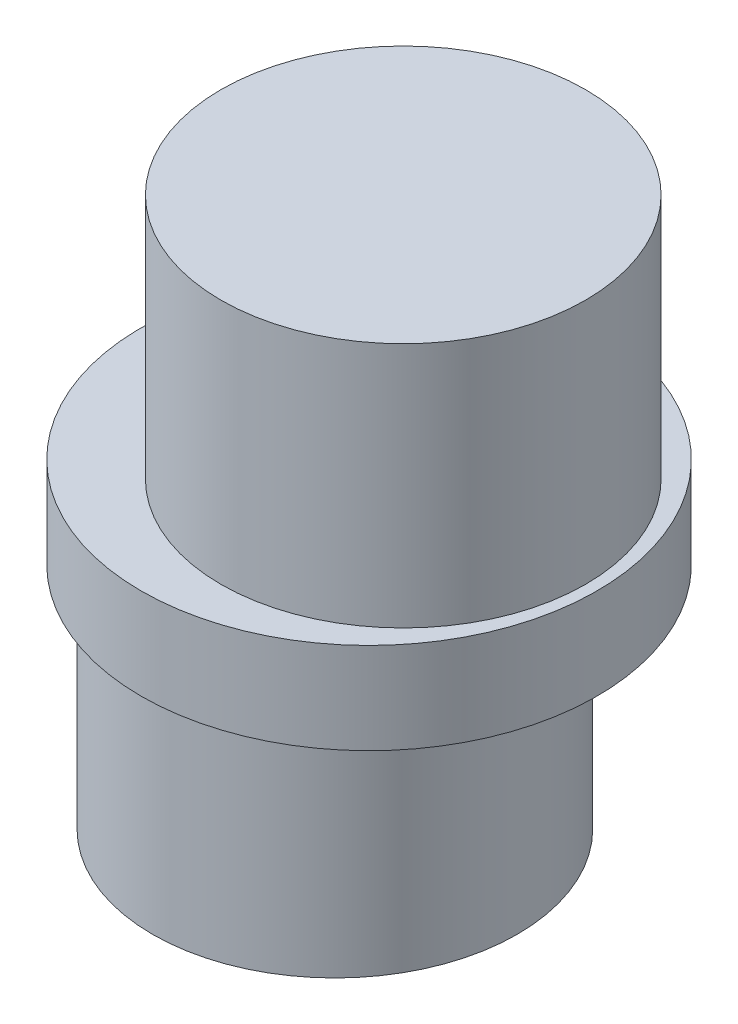
ISO-10303-21;
HEADER;
FILE_DESCRIPTION(('STEP AP214'),'2;1');
FILE_NAME('part.step','',(''),(''),'','','');
FILE_SCHEMA(('AUTOMOTIVE_DESIGN { 1 0 10303 214 1 1 1 1 }'));
ENDSEC;
DATA;
#1=APPLICATION_CONTEXT('core data for automotive mechanical design processes');
#2=APPLICATION_PROTOCOL_DEFINITION('international standard','automotive_design',2000,#1);
#3=PRODUCT_CONTEXT('',#1,'mechanical');
#4=PRODUCT('Part','Part','',(#3));
#5=PRODUCT_RELATED_PRODUCT_CATEGORY('part','',(#4));
#6=PRODUCT_DEFINITION_FORMATION('','',#4);
#7=PRODUCT_DEFINITION_CONTEXT('part definition',#1,'design');
#8=PRODUCT_DEFINITION('design','',#6,#7);
#9=PRODUCT_DEFINITION_SHAPE('','',#8);
#10=(LENGTH_UNIT() NAMED_UNIT(*) SI_UNIT(.MILLI.,.METRE.));
#11=(NAMED_UNIT(*) PLANE_ANGLE_UNIT() SI_UNIT($,.RADIAN.));
#12=(NAMED_UNIT(*) SI_UNIT($,.STERADIAN.) SOLID_ANGLE_UNIT());
#13=UNCERTAINTY_MEASURE_WITH_UNIT(LENGTH_MEASURE(1.E-05),#10,'distance_accuracy_value','');
#14=(GEOMETRIC_REPRESENTATION_CONTEXT(3) GLOBAL_UNCERTAINTY_ASSIGNED_CONTEXT((#13)) GLOBAL_UNIT_ASSIGNED_CONTEXT((#10,
#11,#12)) REPRESENTATION_CONTEXT('',''));
#15=CARTESIAN_POINT('',(0.,0.,0.));
#16=DIRECTION('',(0.,0.,1.));
#17=DIRECTION('',(1.,0.,0.));
#18=AXIS2_PLACEMENT_3D('',#15,#16,#17);
#19=CARTESIAN_POINT('',(0.,3.,0.));
#20=DIRECTION('',(0.,-1.,0.));
#21=DIRECTION('',(0.,0.,-1.));
#22=AXIS2_PLACEMENT_3D('',#19,#20,#21);
#23=CYLINDRICAL_SURFACE('',#22,7.5);
#24=CARTESIAN_POINT('',(0.,3.,0.));
#25=DIRECTION('',(0.,1.,0.));
#26=DIRECTION('',(0.,0.,1.));
#27=AXIS2_PLACEMENT_3D('',#24,#25,#26);
#28=CIRCLE('',#27,7.5);
#29=CARTESIAN_POINT('',(0.,3.,7.5));
#30=VERTEX_POINT('',#29);
#31=EDGE_CURVE('E47',#30,#30,#28,.T.);
#32=ORIENTED_EDGE('',*,*,#31,.F.);
#33=EDGE_LOOP('',(#32));
#34=FACE_BOUND('',#33,.T.);
#35=CARTESIAN_POINT('',(0.,0.,0.));
#36=DIRECTION('',(0.,1.,0.));
#37=DIRECTION('',(0.,0.,1.));
#38=AXIS2_PLACEMENT_3D('',#35,#36,#37);
#39=CIRCLE('',#38,7.5);
#40=CARTESIAN_POINT('',(0.,0.,7.5));
#41=VERTEX_POINT('',#40);
#42=EDGE_CURVE('E37',#41,#41,#39,.T.);
#43=ORIENTED_EDGE('',*,*,#42,.T.);
#44=EDGE_LOOP('',(#43));
#45=FACE_BOUND('',#44,.T.);
#46=ADVANCED_FACE('F40',(#34,#45),#23,.T.);
#47=CARTESIAN_POINT('',(0.,3.,0.));
#48=DIRECTION('',(0.,1.,0.));
#49=DIRECTION('',(0.,0.,1.));
#50=AXIS2_PLACEMENT_3D('',#47,#48,#49);
#51=PLANE('',#50);
#52=CARTESIAN_POINT('',(1.125,3.,0.));
#53=DIRECTION('',(0.,1.,0.));
#54=DIRECTION('',(0.,0.,1.));
#55=AXIS2_PLACEMENT_3D('',#52,#53,#54);
#56=CIRCLE('',#55,6.);
#57=CARTESIAN_POINT('',(1.125,3.,6.));
#58=VERTEX_POINT('',#57);
#59=EDGE_CURVE('E42',#58,#58,#56,.T.);
#60=ORIENTED_EDGE('',*,*,#59,.F.);
#61=EDGE_LOOP('',(#60));
#62=FACE_BOUND('',#61,.T.);
#63=ORIENTED_EDGE('',*,*,#31,.T.);
#64=EDGE_LOOP('',(#63));
#65=FACE_BOUND('',#64,.T.);
#66=ADVANCED_FACE('F66',(#62,#65),#51,.T.);
#67=CARTESIAN_POINT('',(0.,0.,0.));
#68=DIRECTION('',(0.,1.,0.));
#69=DIRECTION('',(0.,0.,1.));
#70=AXIS2_PLACEMENT_3D('',#67,#68,#69);
#71=PLANE('',#70);
#72=CARTESIAN_POINT('',(-1.125,0.,0.));
#73=DIRECTION('',(0.,-1.,0.));
#74=DIRECTION('',(0.,0.,-1.));
#75=AXIS2_PLACEMENT_3D('',#72,#73,#74);
#76=CIRCLE('',#75,6.);
#77=CARTESIAN_POINT('',(-1.125,0.,-6.));
#78=VERTEX_POINT('',#77);
#79=EDGE_CURVE('E10',#78,#78,#76,.T.);
#80=ORIENTED_EDGE('',*,*,#79,.F.);
#81=EDGE_LOOP('',(#80));
#82=FACE_BOUND('',#81,.T.);
#83=ORIENTED_EDGE('',*,*,#42,.F.);
#84=EDGE_LOOP('',(#83));
#85=FACE_BOUND('',#84,.T.);
#86=ADVANCED_FACE('F62',(#82,#85),#71,.F.);
#87=CARTESIAN_POINT('',(1.125,11.1,0.));
#88=DIRECTION('',(0.,-1.,0.));
#89=DIRECTION('',(0.,0.,-1.));
#90=AXIS2_PLACEMENT_3D('',#87,#88,#89);
#91=CYLINDRICAL_SURFACE('',#90,6.);
#92=CARTESIAN_POINT('',(1.125,11.1,0.));
#93=DIRECTION('',(0.,1.,0.));
#94=DIRECTION('',(0.,0.,1.));
#95=AXIS2_PLACEMENT_3D('',#92,#93,#94);
#96=CIRCLE('',#95,6.);
#97=CARTESIAN_POINT('',(1.125,11.1,6.));
#98=VERTEX_POINT('',#97);
#99=EDGE_CURVE('E53',#98,#98,#96,.T.);
#100=ORIENTED_EDGE('',*,*,#99,.F.);
#101=EDGE_LOOP('',(#100));
#102=FACE_BOUND('',#101,.T.);
#103=ORIENTED_EDGE('',*,*,#59,.T.);
#104=EDGE_LOOP('',(#103));
#105=FACE_BOUND('',#104,.T.);
#106=ADVANCED_FACE('F64',(#102,#105),#91,.T.);
#107=CARTESIAN_POINT('',(1.125,11.1,0.));
#108=DIRECTION('',(0.,1.,0.));
#109=DIRECTION('',(0.,0.,1.));
#110=AXIS2_PLACEMENT_3D('',#107,#108,#109);
#111=PLANE('',#110);
#112=ORIENTED_EDGE('',*,*,#99,.T.);
#113=EDGE_LOOP('',(#112));
#114=FACE_BOUND('',#113,.T.);
#115=ADVANCED_FACE('F71',(#114),#111,.T.);
#116=CARTESIAN_POINT('',(-1.125,-8.1,0.));
#117=DIRECTION('',(0.,1.,0.));
#118=DIRECTION('',(0.,0.,1.));
#119=AXIS2_PLACEMENT_3D('',#116,#117,#118);
#120=CYLINDRICAL_SURFACE('',#119,6.);
#121=CARTESIAN_POINT('',(-1.125,-8.1,0.));
#122=DIRECTION('',(0.,-1.,0.));
#123=DIRECTION('',(0.,0.,-1.));
#124=AXIS2_PLACEMENT_3D('',#121,#122,#123);
#125=CIRCLE('',#124,6.);
#126=CARTESIAN_POINT('',(-1.125,-8.1,-6.));
#127=VERTEX_POINT('',#126);
#128=EDGE_CURVE('E52',#127,#127,#125,.T.);
#129=ORIENTED_EDGE('',*,*,#128,.F.);
#130=EDGE_LOOP('',(#129));
#131=FACE_BOUND('',#130,.T.);
#132=ORIENTED_EDGE('',*,*,#79,.T.);
#133=EDGE_LOOP('',(#132));
#134=FACE_BOUND('',#133,.T.);
#135=ADVANCED_FACE('F98',(#131,#134),#120,.T.);
#136=CARTESIAN_POINT('',(-1.125,-8.1,0.));
#137=DIRECTION('',(0.,-1.,0.));
#138=DIRECTION('',(0.,0.,-1.));
#139=AXIS2_PLACEMENT_3D('',#136,#137,#138);
#140=PLANE('',#139);
#141=ORIENTED_EDGE('',*,*,#128,.T.);
#142=EDGE_LOOP('',(#141));
#143=FACE_BOUND('',#142,.T.);
#144=ADVANCED_FACE('F109',(#143),#140,.T.);
#145=CLOSED_SHELL('',(#46,#66,#86,#106,#115,#135,#144));
#146=MANIFOLD_SOLID_BREP('B2',#145);
#147=ADVANCED_BREP_SHAPE_REPRESENTATION('',(#18,#146),#14);
#148=SHAPE_DEFINITION_REPRESENTATION(#9,#147);
ENDSEC;
END-ISO-10303-21;
